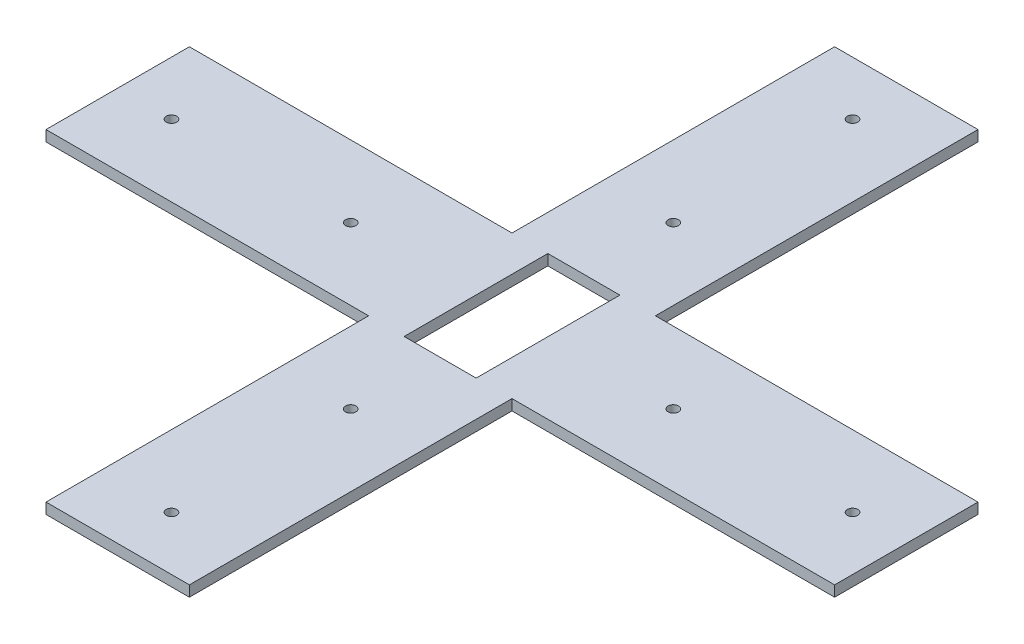
ISO-10303-21;
HEADER;
FILE_DESCRIPTION(('STEP AP214'),'2;1');
FILE_NAME('part.step','',(''),(''),'','','');
FILE_SCHEMA(('AUTOMOTIVE_DESIGN { 1 0 10303 214 1 1 1 1 }'));
ENDSEC;
DATA;
#1=APPLICATION_CONTEXT('core data for automotive mechanical design processes');
#2=APPLICATION_PROTOCOL_DEFINITION('international standard','automotive_design',2000,#1);
#3=PRODUCT_CONTEXT('',#1,'mechanical');
#4=PRODUCT('Part','Part','',(#3));
#5=PRODUCT_RELATED_PRODUCT_CATEGORY('part','',(#4));
#6=PRODUCT_DEFINITION_FORMATION('','',#4);
#7=PRODUCT_DEFINITION_CONTEXT('part definition',#1,'design');
#8=PRODUCT_DEFINITION('design','',#6,#7);
#9=PRODUCT_DEFINITION_SHAPE('','',#8);
#10=(LENGTH_UNIT() NAMED_UNIT(*) SI_UNIT(.MILLI.,.METRE.));
#11=(NAMED_UNIT(*) PLANE_ANGLE_UNIT() SI_UNIT($,.RADIAN.));
#12=(NAMED_UNIT(*) SI_UNIT($,.STERADIAN.) SOLID_ANGLE_UNIT());
#13=UNCERTAINTY_MEASURE_WITH_UNIT(LENGTH_MEASURE(1.E-05),#10,'distance_accuracy_value','');
#14=(GEOMETRIC_REPRESENTATION_CONTEXT(3) GLOBAL_UNCERTAINTY_ASSIGNED_CONTEXT((#13)) GLOBAL_UNIT_ASSIGNED_CONTEXT((#10,
#11,#12)) REPRESENTATION_CONTEXT('',''));
#15=CARTESIAN_POINT('',(0.,0.,0.));
#16=DIRECTION('',(0.,0.,1.));
#17=DIRECTION('',(1.,0.,0.));
#18=AXIS2_PLACEMENT_3D('',#15,#16,#17);
#19=CARTESIAN_POINT('',(0.,3.,-20.05));
#20=DIRECTION('',(0.,0.,-1.));
#21=DIRECTION('',(-1.,0.,0.));
#22=AXIS2_PLACEMENT_3D('',#19,#20,#21);
#23=PLANE('',#22);
#24=DIRECTION('',(1.,0.,0.));
#25=VECTOR('',#24,1.);
#26=CARTESIAN_POINT('',(0.,0.,-20.05));
#27=LINE('',#26,#25);
#28=CARTESIAN_POINT('',(-10.05,0.,-20.05));
#29=VERTEX_POINT('',#28);
#30=CARTESIAN_POINT('',(10.05,0.,-20.05));
#31=VERTEX_POINT('',#30);
#32=EDGE_CURVE('E240',#29,#31,#27,.T.);
#33=ORIENTED_EDGE('',*,*,#32,.T.);
#34=DIRECTION('',(0.,-1.,0.));
#35=VECTOR('',#34,1.);
#36=CARTESIAN_POINT('',(10.05,3.,-20.05));
#37=LINE('',#36,#35);
#38=CARTESIAN_POINT('',(10.05,3.,-20.05));
#39=VERTEX_POINT('',#38);
#40=EDGE_CURVE('E11',#39,#31,#37,.T.);
#41=ORIENTED_EDGE('',*,*,#40,.F.);
#42=DIRECTION('',(1.,0.,0.));
#43=VECTOR('',#42,1.);
#44=CARTESIAN_POINT('',(0.,3.,-20.05));
#45=LINE('',#44,#43);
#46=CARTESIAN_POINT('',(-10.05,3.,-20.05));
#47=VERTEX_POINT('',#46);
#48=EDGE_CURVE('E163',#47,#39,#45,.T.);
#49=ORIENTED_EDGE('',*,*,#48,.F.);
#50=DIRECTION('',(0.,-1.,0.));
#51=VECTOR('',#50,1.);
#52=CARTESIAN_POINT('',(-10.05,3.,-20.05));
#53=LINE('',#52,#51);
#54=EDGE_CURVE('E54',#47,#29,#53,.T.);
#55=ORIENTED_EDGE('',*,*,#54,.T.);
#56=EDGE_LOOP('',(#33,#41,#49,#55));
#57=FACE_BOUND('',#56,.T.);
#58=ADVANCED_FACE('F35',(#57),#23,.F.);
#59=CARTESIAN_POINT('',(10.05,3.,0.));
#60=DIRECTION('',(1.,0.,0.));
#61=DIRECTION('',(0.,0.,-1.));
#62=AXIS2_PLACEMENT_3D('',#59,#60,#61);
#63=PLANE('',#62);
#64=DIRECTION('',(0.,0.,1.));
#65=VECTOR('',#64,1.);
#66=CARTESIAN_POINT('',(10.05,0.,0.));
#67=LINE('',#66,#65);
#68=CARTESIAN_POINT('',(10.05,0.,20.05));
#69=VERTEX_POINT('',#68);
#70=EDGE_CURVE('E169',#31,#69,#67,.T.);
#71=ORIENTED_EDGE('',*,*,#70,.T.);
#72=DIRECTION('',(0.,-1.,0.));
#73=VECTOR('',#72,1.);
#74=CARTESIAN_POINT('',(10.05,3.,20.05));
#75=LINE('',#74,#73);
#76=CARTESIAN_POINT('',(10.05,3.,20.05));
#77=VERTEX_POINT('',#76);
#78=EDGE_CURVE('E45',#77,#69,#75,.T.);
#79=ORIENTED_EDGE('',*,*,#78,.F.);
#80=DIRECTION('',(0.,0.,1.));
#81=VECTOR('',#80,1.);
#82=CARTESIAN_POINT('',(10.05,3.,0.));
#83=LINE('',#82,#81);
#84=EDGE_CURVE('E156',#39,#77,#83,.T.);
#85=ORIENTED_EDGE('',*,*,#84,.F.);
#86=ORIENTED_EDGE('',*,*,#40,.T.);
#87=EDGE_LOOP('',(#71,#79,#85,#86));
#88=FACE_BOUND('',#87,.T.);
#89=ADVANCED_FACE('F168',(#88),#63,.F.);
#90=CARTESIAN_POINT('',(0.,3.,20.05));
#91=DIRECTION('',(0.,0.,-1.));
#92=DIRECTION('',(-1.,0.,0.));
#93=AXIS2_PLACEMENT_3D('',#90,#91,#92);
#94=PLANE('',#93);
#95=DIRECTION('',(1.,0.,0.));
#96=VECTOR('',#95,1.);
#97=CARTESIAN_POINT('',(0.,0.,20.05));
#98=LINE('',#97,#96);
#99=CARTESIAN_POINT('',(-10.05,0.,20.05));
#100=VERTEX_POINT('',#99);
#101=EDGE_CURVE('E243',#100,#69,#98,.T.);
#102=ORIENTED_EDGE('',*,*,#101,.F.);
#103=DIRECTION('',(0.,-1.,0.));
#104=VECTOR('',#103,1.);
#105=CARTESIAN_POINT('',(-10.05,3.,20.05));
#106=LINE('',#105,#104);
#107=CARTESIAN_POINT('',(-10.05,3.,20.05));
#108=VERTEX_POINT('',#107);
#109=EDGE_CURVE('E104',#108,#100,#106,.T.);
#110=ORIENTED_EDGE('',*,*,#109,.F.);
#111=DIRECTION('',(1.,0.,0.));
#112=VECTOR('',#111,1.);
#113=CARTESIAN_POINT('',(0.,3.,20.05));
#114=LINE('',#113,#112);
#115=EDGE_CURVE('E162',#108,#77,#114,.T.);
#116=ORIENTED_EDGE('',*,*,#115,.T.);
#117=ORIENTED_EDGE('',*,*,#78,.T.);
#118=EDGE_LOOP('',(#102,#110,#116,#117));
#119=FACE_BOUND('',#118,.T.);
#120=ADVANCED_FACE('F173',(#119),#94,.T.);
#121=CARTESIAN_POINT('',(0.,3.,-20.));
#122=DIRECTION('',(0.,0.,-1.));
#123=DIRECTION('',(-1.,0.,0.));
#124=AXIS2_PLACEMENT_3D('',#121,#122,#123);
#125=PLANE('',#124);
#126=DIRECTION('',(1.,0.,0.));
#127=VECTOR('',#126,1.);
#128=CARTESIAN_POINT('',(0.,0.,-20.));
#129=LINE('',#128,#127);
#130=CARTESIAN_POINT('',(20.,0.,-20.));
#131=VERTEX_POINT('',#130);
#132=CARTESIAN_POINT('',(110.,0.,-20.0000000000001));
#133=VERTEX_POINT('',#132);
#134=EDGE_CURVE('E204',#131,#133,#129,.T.);
#135=ORIENTED_EDGE('',*,*,#134,.F.);
#136=DIRECTION('',(0.,-1.,0.));
#137=VECTOR('',#136,1.);
#138=CARTESIAN_POINT('',(20.,3.,-20.));
#139=LINE('',#138,#137);
#140=CARTESIAN_POINT('',(20.,3.,-20.));
#141=VERTEX_POINT('',#140);
#142=EDGE_CURVE('E39',#141,#131,#139,.T.);
#143=ORIENTED_EDGE('',*,*,#142,.F.);
#144=DIRECTION('',(1.,0.,0.));
#145=VECTOR('',#144,1.);
#146=CARTESIAN_POINT('',(0.,3.,-20.));
#147=LINE('',#146,#145);
#148=CARTESIAN_POINT('',(110.,3.,-20.0000000000001));
#149=VERTEX_POINT('',#148);
#150=EDGE_CURVE('E308',#141,#149,#147,.T.);
#151=ORIENTED_EDGE('',*,*,#150,.T.);
#152=DIRECTION('',(0.,-1.,0.));
#153=VECTOR('',#152,1.);
#154=CARTESIAN_POINT('',(110.,3.,-20.0000000000001));
#155=LINE('',#154,#153);
#156=EDGE_CURVE('E185',#149,#133,#155,.T.);
#157=ORIENTED_EDGE('',*,*,#156,.T.);
#158=EDGE_LOOP('',(#135,#143,#151,#157));
#159=FACE_BOUND('',#158,.T.);
#160=ADVANCED_FACE('F288',(#159),#125,.T.);
#161=CARTESIAN_POINT('',(20.,3.,0.));
#162=DIRECTION('',(1.,0.,0.));
#163=DIRECTION('',(0.,0.,-1.));
#164=AXIS2_PLACEMENT_3D('',#161,#162,#163);
#165=PLANE('',#164);
#166=DIRECTION('',(0.,0.,1.));
#167=VECTOR('',#166,1.);
#168=CARTESIAN_POINT('',(20.,0.,0.));
#169=LINE('',#168,#167);
#170=CARTESIAN_POINT('',(20.,0.,-110.));
#171=VERTEX_POINT('',#170);
#172=EDGE_CURVE('E207',#171,#131,#169,.T.);
#173=ORIENTED_EDGE('',*,*,#172,.F.);
#174=DIRECTION('',(0.,-1.,0.));
#175=VECTOR('',#174,1.);
#176=CARTESIAN_POINT('',(20.,3.,-110.));
#177=LINE('',#176,#175);
#178=CARTESIAN_POINT('',(20.,3.,-110.));
#179=VERTEX_POINT('',#178);
#180=EDGE_CURVE('E278',#179,#171,#177,.T.);
#181=ORIENTED_EDGE('',*,*,#180,.F.);
#182=DIRECTION('',(0.,0.,1.));
#183=VECTOR('',#182,1.);
#184=CARTESIAN_POINT('',(20.,3.,0.));
#185=LINE('',#184,#183);
#186=EDGE_CURVE('E287',#179,#141,#185,.T.);
#187=ORIENTED_EDGE('',*,*,#186,.T.);
#188=ORIENTED_EDGE('',*,*,#142,.T.);
#189=EDGE_LOOP('',(#173,#181,#187,#188));
#190=FACE_BOUND('',#189,.T.);
#191=ADVANCED_FACE('F285',(#190),#165,.T.);
#192=CARTESIAN_POINT('',(0.,3.,-110.));
#193=DIRECTION('',(0.,0.,-1.));
#194=DIRECTION('',(-1.,0.,0.));
#195=AXIS2_PLACEMENT_3D('',#192,#193,#194);
#196=PLANE('',#195);
#197=DIRECTION('',(1.,0.,0.));
#198=VECTOR('',#197,1.);
#199=CARTESIAN_POINT('',(0.,0.,-110.));
#200=LINE('',#199,#198);
#201=CARTESIAN_POINT('',(-20.,0.,-110.));
#202=VERTEX_POINT('',#201);
#203=EDGE_CURVE('E210',#202,#171,#200,.T.);
#204=ORIENTED_EDGE('',*,*,#203,.F.);
#205=DIRECTION('',(0.,-1.,0.));
#206=VECTOR('',#205,1.);
#207=CARTESIAN_POINT('',(-20.,3.,-110.));
#208=LINE('',#207,#206);
#209=CARTESIAN_POINT('',(-20.,3.,-110.));
#210=VERTEX_POINT('',#209);
#211=EDGE_CURVE('E277',#210,#202,#208,.T.);
#212=ORIENTED_EDGE('',*,*,#211,.F.);
#213=DIRECTION('',(1.,0.,0.));
#214=VECTOR('',#213,1.);
#215=CARTESIAN_POINT('',(0.,3.,-110.));
#216=LINE('',#215,#214);
#217=EDGE_CURVE('E297',#210,#179,#216,.T.);
#218=ORIENTED_EDGE('',*,*,#217,.T.);
#219=ORIENTED_EDGE('',*,*,#180,.T.);
#220=EDGE_LOOP('',(#204,#212,#218,#219));
#221=FACE_BOUND('',#220,.T.);
#222=ADVANCED_FACE('F294',(#221),#196,.T.);
#223=CARTESIAN_POINT('',(-20.,3.,0.));
#224=DIRECTION('',(1.,0.,0.));
#225=DIRECTION('',(0.,0.,-1.));
#226=AXIS2_PLACEMENT_3D('',#223,#224,#225);
#227=PLANE('',#226);
#228=DIRECTION('',(0.,0.,1.));
#229=VECTOR('',#228,1.);
#230=CARTESIAN_POINT('',(-20.,0.,0.));
#231=LINE('',#230,#229);
#232=CARTESIAN_POINT('',(-20.,0.,-20.));
#233=VERTEX_POINT('',#232);
#234=EDGE_CURVE('E213',#202,#233,#231,.T.);
#235=ORIENTED_EDGE('',*,*,#234,.T.);
#236=DIRECTION('',(0.,-1.,0.));
#237=VECTOR('',#236,1.);
#238=CARTESIAN_POINT('',(-20.,3.,-20.));
#239=LINE('',#238,#237);
#240=CARTESIAN_POINT('',(-20.,3.,-20.));
#241=VERTEX_POINT('',#240);
#242=EDGE_CURVE('E275',#241,#233,#239,.T.);
#243=ORIENTED_EDGE('',*,*,#242,.F.);
#244=DIRECTION('',(0.,0.,1.));
#245=VECTOR('',#244,1.);
#246=CARTESIAN_POINT('',(-20.,3.,0.));
#247=LINE('',#246,#245);
#248=EDGE_CURVE('E300',#210,#241,#247,.T.);
#249=ORIENTED_EDGE('',*,*,#248,.F.);
#250=ORIENTED_EDGE('',*,*,#211,.T.);
#251=EDGE_LOOP('',(#235,#243,#249,#250));
#252=FACE_BOUND('',#251,.T.);
#253=ADVANCED_FACE('F301',(#252),#227,.F.);
#254=CARTESIAN_POINT('',(0.,3.,-20.));
#255=DIRECTION('',(0.,0.,-1.));
#256=DIRECTION('',(-1.,0.,0.));
#257=AXIS2_PLACEMENT_3D('',#254,#255,#256);
#258=PLANE('',#257);
#259=DIRECTION('',(1.,0.,0.));
#260=VECTOR('',#259,1.);
#261=CARTESIAN_POINT('',(0.,0.,-20.));
#262=LINE('',#261,#260);
#263=CARTESIAN_POINT('',(-110.,0.,-19.9999999999999));
#264=VERTEX_POINT('',#263);
#265=EDGE_CURVE('E216',#264,#233,#262,.T.);
#266=ORIENTED_EDGE('',*,*,#265,.F.);
#267=DIRECTION('',(0.,-1.,0.));
#268=VECTOR('',#267,1.);
#269=CARTESIAN_POINT('',(-110.,3.,-19.9999999999999));
#270=LINE('',#269,#268);
#271=CARTESIAN_POINT('',(-110.,3.,-19.9999999999999));
#272=VERTEX_POINT('',#271);
#273=EDGE_CURVE('E273',#272,#264,#270,.T.);
#274=ORIENTED_EDGE('',*,*,#273,.F.);
#275=DIRECTION('',(1.,0.,0.));
#276=VECTOR('',#275,1.);
#277=CARTESIAN_POINT('',(0.,3.,-20.));
#278=LINE('',#277,#276);
#279=EDGE_CURVE('E305',#272,#241,#278,.T.);
#280=ORIENTED_EDGE('',*,*,#279,.T.);
#281=ORIENTED_EDGE('',*,*,#242,.T.);
#282=EDGE_LOOP('',(#266,#274,#280,#281));
#283=FACE_BOUND('',#282,.T.);
#284=ADVANCED_FACE('F359',(#283),#258,.T.);
#285=CARTESIAN_POINT('',(-110.,3.,0.));
#286=DIRECTION('',(1.,0.,0.));
#287=DIRECTION('',(0.,0.,-1.));
#288=AXIS2_PLACEMENT_3D('',#285,#286,#287);
#289=PLANE('',#288);
#290=DIRECTION('',(0.,0.,1.));
#291=VECTOR('',#290,1.);
#292=CARTESIAN_POINT('',(-110.,0.,0.));
#293=LINE('',#292,#291);
#294=CARTESIAN_POINT('',(-110.,0.,20.0000000000001));
#295=VERTEX_POINT('',#294);
#296=EDGE_CURVE('E219',#264,#295,#293,.T.);
#297=ORIENTED_EDGE('',*,*,#296,.T.);
#298=DIRECTION('',(0.,-1.,0.));
#299=VECTOR('',#298,1.);
#300=CARTESIAN_POINT('',(-110.,3.,20.0000000000001));
#301=LINE('',#300,#299);
#302=CARTESIAN_POINT('',(-110.,3.,20.0000000000001));
#303=VERTEX_POINT('',#302);
#304=EDGE_CURVE('E270',#303,#295,#301,.T.);
#305=ORIENTED_EDGE('',*,*,#304,.F.);
#306=DIRECTION('',(0.,0.,1.));
#307=VECTOR('',#306,1.);
#308=CARTESIAN_POINT('',(-110.,3.,0.));
#309=LINE('',#308,#307);
#310=EDGE_CURVE('E313',#272,#303,#309,.T.);
#311=ORIENTED_EDGE('',*,*,#310,.F.);
#312=ORIENTED_EDGE('',*,*,#273,.T.);
#313=EDGE_LOOP('',(#297,#305,#311,#312));
#314=FACE_BOUND('',#313,.T.);
#315=ADVANCED_FACE('F356',(#314),#289,.F.);
#316=CARTESIAN_POINT('',(0.,3.,20.));
#317=DIRECTION('',(0.,0.,-1.));
#318=DIRECTION('',(-1.,0.,0.));
#319=AXIS2_PLACEMENT_3D('',#316,#317,#318);
#320=PLANE('',#319);
#321=DIRECTION('',(1.,0.,0.));
#322=VECTOR('',#321,1.);
#323=CARTESIAN_POINT('',(0.,0.,20.));
#324=LINE('',#323,#322);
#325=CARTESIAN_POINT('',(-20.,0.,20.));
#326=VERTEX_POINT('',#325);
#327=EDGE_CURVE('E222',#295,#326,#324,.T.);
#328=ORIENTED_EDGE('',*,*,#327,.T.);
#329=DIRECTION('',(0.,-1.,0.));
#330=VECTOR('',#329,1.);
#331=CARTESIAN_POINT('',(-20.,3.,20.));
#332=LINE('',#331,#330);
#333=CARTESIAN_POINT('',(-20.,3.,20.));
#334=VERTEX_POINT('',#333);
#335=EDGE_CURVE('E267',#334,#326,#332,.T.);
#336=ORIENTED_EDGE('',*,*,#335,.F.);
#337=DIRECTION('',(1.,0.,0.));
#338=VECTOR('',#337,1.);
#339=CARTESIAN_POINT('',(0.,3.,20.));
#340=LINE('',#339,#338);
#341=EDGE_CURVE('E316',#303,#334,#340,.T.);
#342=ORIENTED_EDGE('',*,*,#341,.F.);
#343=ORIENTED_EDGE('',*,*,#304,.T.);
#344=EDGE_LOOP('',(#328,#336,#342,#343));
#345=FACE_BOUND('',#344,.T.);
#346=ADVANCED_FACE('F352',(#345),#320,.F.);
#347=CARTESIAN_POINT('',(-20.,3.,0.));
#348=DIRECTION('',(1.,0.,0.));
#349=DIRECTION('',(0.,0.,-1.));
#350=AXIS2_PLACEMENT_3D('',#347,#348,#349);
#351=PLANE('',#350);
#352=DIRECTION('',(0.,0.,1.));
#353=VECTOR('',#352,1.);
#354=CARTESIAN_POINT('',(-20.,0.,0.));
#355=LINE('',#354,#353);
#356=CARTESIAN_POINT('',(-20.,0.,110.));
#357=VERTEX_POINT('',#356);
#358=EDGE_CURVE('E225',#326,#357,#355,.T.);
#359=ORIENTED_EDGE('',*,*,#358,.T.);
#360=DIRECTION('',(0.,-1.,0.));
#361=VECTOR('',#360,1.);
#362=CARTESIAN_POINT('',(-20.,3.,110.));
#363=LINE('',#362,#361);
#364=CARTESIAN_POINT('',(-20.,3.,110.));
#365=VERTEX_POINT('',#364);
#366=EDGE_CURVE('E264',#365,#357,#363,.T.);
#367=ORIENTED_EDGE('',*,*,#366,.F.);
#368=DIRECTION('',(0.,0.,1.));
#369=VECTOR('',#368,1.);
#370=CARTESIAN_POINT('',(-20.,3.,0.));
#371=LINE('',#370,#369);
#372=EDGE_CURVE('E319',#334,#365,#371,.T.);
#373=ORIENTED_EDGE('',*,*,#372,.F.);
#374=ORIENTED_EDGE('',*,*,#335,.T.);
#375=EDGE_LOOP('',(#359,#367,#373,#374));
#376=FACE_BOUND('',#375,.T.);
#377=ADVANCED_FACE('F350',(#376),#351,.F.);
#378=CARTESIAN_POINT('',(0.,3.,110.));
#379=DIRECTION('',(0.,0.,-1.));
#380=DIRECTION('',(-1.,0.,0.));
#381=AXIS2_PLACEMENT_3D('',#378,#379,#380);
#382=PLANE('',#381);
#383=DIRECTION('',(1.,0.,0.));
#384=VECTOR('',#383,1.);
#385=CARTESIAN_POINT('',(0.,0.,110.));
#386=LINE('',#385,#384);
#387=CARTESIAN_POINT('',(20.,0.,110.));
#388=VERTEX_POINT('',#387);
#389=EDGE_CURVE('E228',#357,#388,#386,.T.);
#390=ORIENTED_EDGE('',*,*,#389,.T.);
#391=DIRECTION('',(0.,-1.,0.));
#392=VECTOR('',#391,1.);
#393=CARTESIAN_POINT('',(20.,3.,110.));
#394=LINE('',#393,#392);
#395=CARTESIAN_POINT('',(20.,3.,110.));
#396=VERTEX_POINT('',#395);
#397=EDGE_CURVE('E262',#396,#388,#394,.T.);
#398=ORIENTED_EDGE('',*,*,#397,.F.);
#399=DIRECTION('',(1.,0.,0.));
#400=VECTOR('',#399,1.);
#401=CARTESIAN_POINT('',(0.,3.,110.));
#402=LINE('',#401,#400);
#403=EDGE_CURVE('E322',#365,#396,#402,.T.);
#404=ORIENTED_EDGE('',*,*,#403,.F.);
#405=ORIENTED_EDGE('',*,*,#366,.T.);
#406=EDGE_LOOP('',(#390,#398,#404,#405));
#407=FACE_BOUND('',#406,.T.);
#408=ADVANCED_FACE('F345',(#407),#382,.F.);
#409=CARTESIAN_POINT('',(20.,3.,0.));
#410=DIRECTION('',(1.,0.,0.));
#411=DIRECTION('',(0.,0.,-1.));
#412=AXIS2_PLACEMENT_3D('',#409,#410,#411);
#413=PLANE('',#412);
#414=DIRECTION('',(0.,0.,1.));
#415=VECTOR('',#414,1.);
#416=CARTESIAN_POINT('',(20.,0.,0.));
#417=LINE('',#416,#415);
#418=CARTESIAN_POINT('',(20.,0.,20.));
#419=VERTEX_POINT('',#418);
#420=EDGE_CURVE('E231',#419,#388,#417,.T.);
#421=ORIENTED_EDGE('',*,*,#420,.F.);
#422=DIRECTION('',(0.,-1.,0.));
#423=VECTOR('',#422,1.);
#424=CARTESIAN_POINT('',(20.,3.,20.));
#425=LINE('',#424,#423);
#426=CARTESIAN_POINT('',(20.,3.,20.));
#427=VERTEX_POINT('',#426);
#428=EDGE_CURVE('E260',#427,#419,#425,.T.);
#429=ORIENTED_EDGE('',*,*,#428,.F.);
#430=DIRECTION('',(0.,0.,1.));
#431=VECTOR('',#430,1.);
#432=CARTESIAN_POINT('',(20.,3.,0.));
#433=LINE('',#432,#431);
#434=EDGE_CURVE('E324',#427,#396,#433,.T.);
#435=ORIENTED_EDGE('',*,*,#434,.T.);
#436=ORIENTED_EDGE('',*,*,#397,.T.);
#437=EDGE_LOOP('',(#421,#429,#435,#436));
#438=FACE_BOUND('',#437,.T.);
#439=ADVANCED_FACE('F342',(#438),#413,.T.);
#440=CARTESIAN_POINT('',(0.,3.,20.));
#441=DIRECTION('',(0.,0.,-1.));
#442=DIRECTION('',(-1.,0.,0.));
#443=AXIS2_PLACEMENT_3D('',#440,#441,#442);
#444=PLANE('',#443);
#445=DIRECTION('',(1.,0.,0.));
#446=VECTOR('',#445,1.);
#447=CARTESIAN_POINT('',(0.,0.,20.));
#448=LINE('',#447,#446);
#449=CARTESIAN_POINT('',(110.,0.,20.0000000000001));
#450=VERTEX_POINT('',#449);
#451=EDGE_CURVE('E234',#419,#450,#448,.T.);
#452=ORIENTED_EDGE('',*,*,#451,.T.);
#453=DIRECTION('',(0.,-1.,0.));
#454=VECTOR('',#453,1.);
#455=CARTESIAN_POINT('',(110.,3.,20.0000000000001));
#456=LINE('',#455,#454);
#457=CARTESIAN_POINT('',(110.,3.,20.0000000000001));
#458=VERTEX_POINT('',#457);
#459=EDGE_CURVE('E258',#458,#450,#456,.T.);
#460=ORIENTED_EDGE('',*,*,#459,.F.);
#461=DIRECTION('',(1.,0.,0.));
#462=VECTOR('',#461,1.);
#463=CARTESIAN_POINT('',(0.,3.,20.));
#464=LINE('',#463,#462);
#465=EDGE_CURVE('E327',#427,#458,#464,.T.);
#466=ORIENTED_EDGE('',*,*,#465,.F.);
#467=ORIENTED_EDGE('',*,*,#428,.T.);
#468=EDGE_LOOP('',(#452,#460,#466,#467));
#469=FACE_BOUND('',#468,.T.);
#470=ADVANCED_FACE('F338',(#469),#444,.F.);
#471=CARTESIAN_POINT('',(-45.,3.,0.));
#472=DIRECTION('',(0.,-1.,0.));
#473=DIRECTION('',(0.,0.,-1.));
#474=AXIS2_PLACEMENT_3D('',#471,#472,#473);
#475=CYLINDRICAL_SURFACE('',#474,1.45);
#476=CARTESIAN_POINT('',(-45.,3.,0.));
#477=DIRECTION('',(0.,1.,0.));
#478=DIRECTION('',(0.,0.,1.));
#479=AXIS2_PLACEMENT_3D('',#476,#477,#478);
#480=CIRCLE('',#479,1.45);
#481=CARTESIAN_POINT('',(-45.,3.,1.45000000000001));
#482=VERTEX_POINT('',#481);
#483=EDGE_CURVE('E176',#482,#482,#480,.F.);
#484=ORIENTED_EDGE('',*,*,#483,.F.);
#485=EDGE_LOOP('',(#484));
#486=FACE_BOUND('',#485,.T.);
#487=CARTESIAN_POINT('',(-45.,0.,0.));
#488=DIRECTION('',(0.,1.,0.));
#489=DIRECTION('',(0.,0.,1.));
#490=AXIS2_PLACEMENT_3D('',#487,#488,#489);
#491=CIRCLE('',#490,1.45);
#492=CARTESIAN_POINT('',(-45.,0.,1.45000000000001));
#493=VERTEX_POINT('',#492);
#494=EDGE_CURVE('E248',#493,#493,#491,.F.);
#495=ORIENTED_EDGE('',*,*,#494,.T.);
#496=EDGE_LOOP('',(#495));
#497=FACE_BOUND('',#496,.T.);
#498=ADVANCED_FACE('F382',(#486,#497),#475,.F.);
#499=CARTESIAN_POINT('',(-10.05,3.,0.));
#500=DIRECTION('',(1.,0.,0.));
#501=DIRECTION('',(0.,0.,-1.));
#502=AXIS2_PLACEMENT_3D('',#499,#500,#501);
#503=PLANE('',#502);
#504=DIRECTION('',(0.,0.,1.));
#505=VECTOR('',#504,1.);
#506=CARTESIAN_POINT('',(-10.05,0.,0.));
#507=LINE('',#506,#505);
#508=EDGE_CURVE('E245',#29,#100,#507,.T.);
#509=ORIENTED_EDGE('',*,*,#508,.F.);
#510=ORIENTED_EDGE('',*,*,#54,.F.);
#511=DIRECTION('',(0.,0.,1.));
#512=VECTOR('',#511,1.);
#513=CARTESIAN_POINT('',(-10.05,3.,0.));
#514=LINE('',#513,#512);
#515=EDGE_CURVE('E174',#47,#108,#514,.T.);
#516=ORIENTED_EDGE('',*,*,#515,.T.);
#517=ORIENTED_EDGE('',*,*,#109,.T.);
#518=EDGE_LOOP('',(#509,#510,#516,#517));
#519=FACE_BOUND('',#518,.T.);
#520=ADVANCED_FACE('F379',(#519),#503,.T.);
#521=CARTESIAN_POINT('',(110.,3.,0.));
#522=DIRECTION('',(1.,0.,0.));
#523=DIRECTION('',(0.,0.,-1.));
#524=AXIS2_PLACEMENT_3D('',#521,#522,#523);
#525=PLANE('',#524);
#526=DIRECTION('',(0.,0.,1.));
#527=VECTOR('',#526,1.);
#528=CARTESIAN_POINT('',(110.,0.,0.));
#529=LINE('',#528,#527);
#530=EDGE_CURVE('E237',#133,#450,#529,.T.);
#531=ORIENTED_EDGE('',*,*,#530,.F.);
#532=ORIENTED_EDGE('',*,*,#156,.F.);
#533=DIRECTION('',(0.,0.,1.));
#534=VECTOR('',#533,1.);
#535=CARTESIAN_POINT('',(110.,3.,0.));
#536=LINE('',#535,#534);
#537=EDGE_CURVE('E329',#149,#458,#536,.T.);
#538=ORIENTED_EDGE('',*,*,#537,.T.);
#539=ORIENTED_EDGE('',*,*,#459,.T.);
#540=EDGE_LOOP('',(#531,#532,#538,#539));
#541=FACE_BOUND('',#540,.T.);
#542=ADVANCED_FACE('F333',(#541),#525,.T.);
#543=CARTESIAN_POINT('',(45.,3.,0.));
#544=DIRECTION('',(0.,-1.,0.));
#545=DIRECTION('',(0.,0.,-1.));
#546=AXIS2_PLACEMENT_3D('',#543,#544,#545);
#547=CYLINDRICAL_SURFACE('',#546,1.45);
#548=CARTESIAN_POINT('',(45.,3.,0.));
#549=DIRECTION('',(0.,1.,0.));
#550=DIRECTION('',(0.,0.,1.));
#551=AXIS2_PLACEMENT_3D('',#548,#549,#550);
#552=CIRCLE('',#551,1.45);
#553=CARTESIAN_POINT('',(45.,3.,1.45000000000001));
#554=VERTEX_POINT('',#553);
#555=EDGE_CURVE('E622',#554,#554,#552,.T.);
#556=ORIENTED_EDGE('',*,*,#555,.T.);
#557=EDGE_LOOP('',(#556));
#558=FACE_BOUND('',#557,.T.);
#559=CARTESIAN_POINT('',(45.,0.,0.));
#560=DIRECTION('',(0.,1.,0.));
#561=DIRECTION('',(0.,0.,1.));
#562=AXIS2_PLACEMENT_3D('',#559,#560,#561);
#563=CIRCLE('',#562,1.45);
#564=CARTESIAN_POINT('',(45.,0.,1.45000000000001));
#565=VERTEX_POINT('',#564);
#566=EDGE_CURVE('E201',#565,#565,#563,.T.);
#567=ORIENTED_EDGE('',*,*,#566,.F.);
#568=EDGE_LOOP('',(#567));
#569=FACE_BOUND('',#568,.T.);
#570=ADVANCED_FACE('F378',(#558,#569),#547,.F.);
#571=CARTESIAN_POINT('',(95.,3.,0.));
#572=DIRECTION('',(0.,-1.,0.));
#573=DIRECTION('',(0.,0.,-1.));
#574=AXIS2_PLACEMENT_3D('',#571,#572,#573);
#575=CYLINDRICAL_SURFACE('',#574,1.45);
#576=CARTESIAN_POINT('',(95.,3.,0.));
#577=DIRECTION('',(0.,1.,0.));
#578=DIRECTION('',(0.,0.,1.));
#579=AXIS2_PLACEMENT_3D('',#576,#577,#578);
#580=CIRCLE('',#579,1.45);
#581=CARTESIAN_POINT('',(95.,3.,1.45000000000002));
#582=VERTEX_POINT('',#581);
#583=EDGE_CURVE('E619',#582,#582,#580,.T.);
#584=ORIENTED_EDGE('',*,*,#583,.T.);
#585=EDGE_LOOP('',(#584));
#586=FACE_BOUND('',#585,.T.);
#587=CARTESIAN_POINT('',(95.,0.,0.));
#588=DIRECTION('',(0.,1.,0.));
#589=DIRECTION('',(0.,0.,1.));
#590=AXIS2_PLACEMENT_3D('',#587,#588,#589);
#591=CIRCLE('',#590,1.45);
#592=CARTESIAN_POINT('',(95.,0.,1.45000000000002));
#593=VERTEX_POINT('',#592);
#594=EDGE_CURVE('E198',#593,#593,#591,.T.);
#595=ORIENTED_EDGE('',*,*,#594,.F.);
#596=EDGE_LOOP('',(#595));
#597=FACE_BOUND('',#596,.T.);
#598=ADVANCED_FACE('F433',(#586,#597),#575,.F.);
#599=CARTESIAN_POINT('',(-95.,3.,0.));
#600=DIRECTION('',(0.,-1.,0.));
#601=DIRECTION('',(0.,0.,-1.));
#602=AXIS2_PLACEMENT_3D('',#599,#600,#601);
#603=CYLINDRICAL_SURFACE('',#602,1.45);
#604=CARTESIAN_POINT('',(-95.,3.,0.));
#605=DIRECTION('',(0.,1.,0.));
#606=DIRECTION('',(0.,0.,1.));
#607=AXIS2_PLACEMENT_3D('',#604,#605,#606);
#608=CIRCLE('',#607,1.45);
#609=CARTESIAN_POINT('',(-95.,3.,1.45000000000002));
#610=VERTEX_POINT('',#609);
#611=EDGE_CURVE('E615',#610,#610,#608,.F.);
#612=ORIENTED_EDGE('',*,*,#611,.F.);
#613=EDGE_LOOP('',(#612));
#614=FACE_BOUND('',#613,.T.);
#615=CARTESIAN_POINT('',(-95.,0.,0.));
#616=DIRECTION('',(0.,1.,0.));
#617=DIRECTION('',(0.,0.,1.));
#618=AXIS2_PLACEMENT_3D('',#615,#616,#617);
#619=CIRCLE('',#618,1.45);
#620=CARTESIAN_POINT('',(-95.,0.,1.45000000000002));
#621=VERTEX_POINT('',#620);
#622=EDGE_CURVE('E195',#621,#621,#619,.F.);
#623=ORIENTED_EDGE('',*,*,#622,.T.);
#624=EDGE_LOOP('',(#623));
#625=FACE_BOUND('',#624,.T.);
#626=ADVANCED_FACE('F441',(#614,#625),#603,.F.);
#627=CARTESIAN_POINT('',(0.,3.,-95.));
#628=DIRECTION('',(0.,-1.,0.));
#629=DIRECTION('',(0.,0.,-1.));
#630=AXIS2_PLACEMENT_3D('',#627,#628,#629);
#631=CYLINDRICAL_SURFACE('',#630,1.45000000000001);
#632=CARTESIAN_POINT('',(0.,3.,-95.));
#633=DIRECTION('',(0.,1.,0.));
#634=DIRECTION('',(0.,0.,1.));
#635=AXIS2_PLACEMENT_3D('',#632,#633,#634);
#636=CIRCLE('',#635,1.45000000000001);
#637=CARTESIAN_POINT('',(0.,3.,-93.55));
#638=VERTEX_POINT('',#637);
#639=EDGE_CURVE('E611',#638,#638,#636,.T.);
#640=ORIENTED_EDGE('',*,*,#639,.T.);
#641=EDGE_LOOP('',(#640));
#642=FACE_BOUND('',#641,.T.);
#643=CARTESIAN_POINT('',(0.,0.,-95.));
#644=DIRECTION('',(0.,1.,0.));
#645=DIRECTION('',(0.,0.,1.));
#646=AXIS2_PLACEMENT_3D('',#643,#644,#645);
#647=CIRCLE('',#646,1.45000000000001);
#648=CARTESIAN_POINT('',(0.,0.,-93.55));
#649=VERTEX_POINT('',#648);
#650=EDGE_CURVE('E192',#649,#649,#647,.T.);
#651=ORIENTED_EDGE('',*,*,#650,.F.);
#652=EDGE_LOOP('',(#651));
#653=FACE_BOUND('',#652,.T.);
#654=ADVANCED_FACE('F449',(#642,#653),#631,.F.);
#655=CARTESIAN_POINT('',(0.,3.,-44.9999999999999));
#656=DIRECTION('',(0.,-1.,0.));
#657=DIRECTION('',(0.,0.,-1.));
#658=AXIS2_PLACEMENT_3D('',#655,#656,#657);
#659=CYLINDRICAL_SURFACE('',#658,1.45);
#660=CARTESIAN_POINT('',(0.,3.,-44.9999999999999));
#661=DIRECTION('',(0.,1.,0.));
#662=DIRECTION('',(0.,0.,1.));
#663=AXIS2_PLACEMENT_3D('',#660,#661,#662);
#664=CIRCLE('',#663,1.45);
#665=CARTESIAN_POINT('',(0.,3.,-43.5499999999999));
#666=VERTEX_POINT('',#665);
#667=EDGE_CURVE('E607',#666,#666,#664,.T.);
#668=ORIENTED_EDGE('',*,*,#667,.T.);
#669=EDGE_LOOP('',(#668));
#670=FACE_BOUND('',#669,.T.);
#671=CARTESIAN_POINT('',(0.,0.,-44.9999999999999));
#672=DIRECTION('',(0.,1.,0.));
#673=DIRECTION('',(0.,0.,1.));
#674=AXIS2_PLACEMENT_3D('',#671,#672,#673);
#675=CIRCLE('',#674,1.45);
#676=CARTESIAN_POINT('',(0.,0.,-43.5499999999999));
#677=VERTEX_POINT('',#676);
#678=EDGE_CURVE('E189',#677,#677,#675,.T.);
#679=ORIENTED_EDGE('',*,*,#678,.F.);
#680=EDGE_LOOP('',(#679));
#681=FACE_BOUND('',#680,.T.);
#682=ADVANCED_FACE('F457',(#670,#681),#659,.F.);
#683=CARTESIAN_POINT('',(0.,3.,44.9999999999999));
#684=DIRECTION('',(0.,-1.,0.));
#685=DIRECTION('',(0.,0.,-1.));
#686=AXIS2_PLACEMENT_3D('',#683,#684,#685);
#687=CYLINDRICAL_SURFACE('',#686,1.45);
#688=CARTESIAN_POINT('',(0.,3.,44.9999999999999));
#689=DIRECTION('',(0.,1.,0.));
#690=DIRECTION('',(0.,0.,1.));
#691=AXIS2_PLACEMENT_3D('',#688,#689,#690);
#692=CIRCLE('',#691,1.45);
#693=CARTESIAN_POINT('',(0.,3.,46.4499999999999));
#694=VERTEX_POINT('',#693);
#695=EDGE_CURVE('E254',#694,#694,#692,.F.);
#696=ORIENTED_EDGE('',*,*,#695,.F.);
#697=EDGE_LOOP('',(#696));
#698=FACE_BOUND('',#697,.T.);
#699=CARTESIAN_POINT('',(0.,0.,44.9999999999999));
#700=DIRECTION('',(0.,1.,0.));
#701=DIRECTION('',(0.,0.,1.));
#702=AXIS2_PLACEMENT_3D('',#699,#700,#701);
#703=CIRCLE('',#702,1.45);
#704=CARTESIAN_POINT('',(0.,0.,46.4499999999999));
#705=VERTEX_POINT('',#704);
#706=EDGE_CURVE('E186',#705,#705,#703,.F.);
#707=ORIENTED_EDGE('',*,*,#706,.T.);
#708=EDGE_LOOP('',(#707));
#709=FACE_BOUND('',#708,.T.);
#710=ADVANCED_FACE('F37',(#698,#709),#687,.F.);
#711=CARTESIAN_POINT('',(0.,3.,95.));
#712=DIRECTION('',(0.,-1.,0.));
#713=DIRECTION('',(0.,0.,-1.));
#714=AXIS2_PLACEMENT_3D('',#711,#712,#713);
#715=CYLINDRICAL_SURFACE('',#714,1.45000000000001);
#716=CARTESIAN_POINT('',(0.,3.,95.));
#717=DIRECTION('',(0.,1.,0.));
#718=DIRECTION('',(0.,0.,1.));
#719=AXIS2_PLACEMENT_3D('',#716,#717,#718);
#720=CIRCLE('',#719,1.45000000000001);
#721=CARTESIAN_POINT('',(0.,3.,96.45));
#722=VERTEX_POINT('',#721);
#723=EDGE_CURVE('E182',#722,#722,#720,.F.);
#724=ORIENTED_EDGE('',*,*,#723,.F.);
#725=EDGE_LOOP('',(#724));
#726=FACE_BOUND('',#725,.T.);
#727=CARTESIAN_POINT('',(0.,0.,95.));
#728=DIRECTION('',(0.,1.,0.));
#729=DIRECTION('',(0.,0.,1.));
#730=AXIS2_PLACEMENT_3D('',#727,#728,#729);
#731=CIRCLE('',#730,1.45000000000001);
#732=CARTESIAN_POINT('',(0.,0.,96.45));
#733=VERTEX_POINT('',#732);
#734=EDGE_CURVE('E251',#733,#733,#731,.F.);
#735=ORIENTED_EDGE('',*,*,#734,.T.);
#736=EDGE_LOOP('',(#735));
#737=FACE_BOUND('',#736,.T.);
#738=ADVANCED_FACE('F471',(#726,#737),#715,.F.);
#739=CARTESIAN_POINT('',(0.,3.,0.));
#740=DIRECTION('',(0.,1.,0.));
#741=DIRECTION('',(0.,0.,1.));
#742=AXIS2_PLACEMENT_3D('',#739,#740,#741);
#743=PLANE('',#742);
#744=ORIENTED_EDGE('',*,*,#695,.T.);
#745=EDGE_LOOP('',(#744));
#746=FACE_BOUND('',#745,.T.);
#747=ORIENTED_EDGE('',*,*,#667,.F.);
#748=EDGE_LOOP('',(#747));
#749=FACE_BOUND('',#748,.T.);
#750=ORIENTED_EDGE('',*,*,#639,.F.);
#751=EDGE_LOOP('',(#750));
#752=FACE_BOUND('',#751,.T.);
#753=ORIENTED_EDGE('',*,*,#611,.T.);
#754=EDGE_LOOP('',(#753));
#755=FACE_BOUND('',#754,.T.);
#756=ORIENTED_EDGE('',*,*,#583,.F.);
#757=EDGE_LOOP('',(#756));
#758=FACE_BOUND('',#757,.T.);
#759=ORIENTED_EDGE('',*,*,#555,.F.);
#760=EDGE_LOOP('',(#759));
#761=FACE_BOUND('',#760,.T.);
#762=ORIENTED_EDGE('',*,*,#150,.F.);
#763=ORIENTED_EDGE('',*,*,#186,.F.);
#764=ORIENTED_EDGE('',*,*,#217,.F.);
#765=ORIENTED_EDGE('',*,*,#248,.T.);
#766=ORIENTED_EDGE('',*,*,#279,.F.);
#767=ORIENTED_EDGE('',*,*,#310,.T.);
#768=ORIENTED_EDGE('',*,*,#341,.T.);
#769=ORIENTED_EDGE('',*,*,#372,.T.);
#770=ORIENTED_EDGE('',*,*,#403,.T.);
#771=ORIENTED_EDGE('',*,*,#434,.F.);
#772=ORIENTED_EDGE('',*,*,#465,.T.);
#773=ORIENTED_EDGE('',*,*,#537,.F.);
#774=EDGE_LOOP('',(#762,#763,#764,#765,#766,#767,#768,#769,#770,#771,#772,#773));
#775=FACE_BOUND('',#774,.T.);
#776=ORIENTED_EDGE('',*,*,#48,.T.);
#777=ORIENTED_EDGE('',*,*,#84,.T.);
#778=ORIENTED_EDGE('',*,*,#115,.F.);
#779=ORIENTED_EDGE('',*,*,#515,.F.);
#780=EDGE_LOOP('',(#776,#777,#778,#779));
#781=FACE_BOUND('',#780,.T.);
#782=ORIENTED_EDGE('',*,*,#483,.T.);
#783=EDGE_LOOP('',(#782));
#784=FACE_BOUND('',#783,.T.);
#785=ORIENTED_EDGE('',*,*,#723,.T.);
#786=EDGE_LOOP('',(#785));
#787=FACE_BOUND('',#786,.T.);
#788=ADVANCED_FACE('F158',(#746,#749,#752,#755,#758,#761,#775,#781,#784,#787),#743,.T.);
#789=CARTESIAN_POINT('',(0.,0.,0.));
#790=DIRECTION('',(0.,1.,0.));
#791=DIRECTION('',(0.,0.,1.));
#792=AXIS2_PLACEMENT_3D('',#789,#790,#791);
#793=PLANE('',#792);
#794=ORIENTED_EDGE('',*,*,#706,.F.);
#795=EDGE_LOOP('',(#794));
#796=FACE_BOUND('',#795,.T.);
#797=ORIENTED_EDGE('',*,*,#678,.T.);
#798=EDGE_LOOP('',(#797));
#799=FACE_BOUND('',#798,.T.);
#800=ORIENTED_EDGE('',*,*,#650,.T.);
#801=EDGE_LOOP('',(#800));
#802=FACE_BOUND('',#801,.T.);
#803=ORIENTED_EDGE('',*,*,#622,.F.);
#804=EDGE_LOOP('',(#803));
#805=FACE_BOUND('',#804,.T.);
#806=ORIENTED_EDGE('',*,*,#594,.T.);
#807=EDGE_LOOP('',(#806));
#808=FACE_BOUND('',#807,.T.);
#809=ORIENTED_EDGE('',*,*,#566,.T.);
#810=EDGE_LOOP('',(#809));
#811=FACE_BOUND('',#810,.T.);
#812=ORIENTED_EDGE('',*,*,#134,.T.);
#813=ORIENTED_EDGE('',*,*,#530,.T.);
#814=ORIENTED_EDGE('',*,*,#451,.F.);
#815=ORIENTED_EDGE('',*,*,#420,.T.);
#816=ORIENTED_EDGE('',*,*,#389,.F.);
#817=ORIENTED_EDGE('',*,*,#358,.F.);
#818=ORIENTED_EDGE('',*,*,#327,.F.);
#819=ORIENTED_EDGE('',*,*,#296,.F.);
#820=ORIENTED_EDGE('',*,*,#265,.T.);
#821=ORIENTED_EDGE('',*,*,#234,.F.);
#822=ORIENTED_EDGE('',*,*,#203,.T.);
#823=ORIENTED_EDGE('',*,*,#172,.T.);
#824=EDGE_LOOP('',(#812,#813,#814,#815,#816,#817,#818,#819,#820,#821,#822,#823));
#825=FACE_BOUND('',#824,.T.);
#826=ORIENTED_EDGE('',*,*,#32,.F.);
#827=ORIENTED_EDGE('',*,*,#508,.T.);
#828=ORIENTED_EDGE('',*,*,#101,.T.);
#829=ORIENTED_EDGE('',*,*,#70,.F.);
#830=EDGE_LOOP('',(#826,#827,#828,#829));
#831=FACE_BOUND('',#830,.T.);
#832=ORIENTED_EDGE('',*,*,#494,.F.);
#833=EDGE_LOOP('',(#832));
#834=FACE_BOUND('',#833,.T.);
#835=ORIENTED_EDGE('',*,*,#734,.F.);
#836=EDGE_LOOP('',(#835));
#837=FACE_BOUND('',#836,.T.);
#838=ADVANCED_FACE('F291',(#796,#799,#802,#805,#808,#811,#825,#831,#834,#837),#793,.F.);
#839=CLOSED_SHELL('',(#58,#89,#120,#160,#191,#222,#253,#284,#315,#346,#377,#408,#439,#470,#498,
#520,#542,#570,#598,#626,#654,#682,#710,#738,#788,#838));
#840=MANIFOLD_SOLID_BREP('B2',#839);
#841=ADVANCED_BREP_SHAPE_REPRESENTATION('',(#18,#840),#14);
#842=SHAPE_DEFINITION_REPRESENTATION(#9,#841);
ENDSEC;
END-ISO-10303-21;
